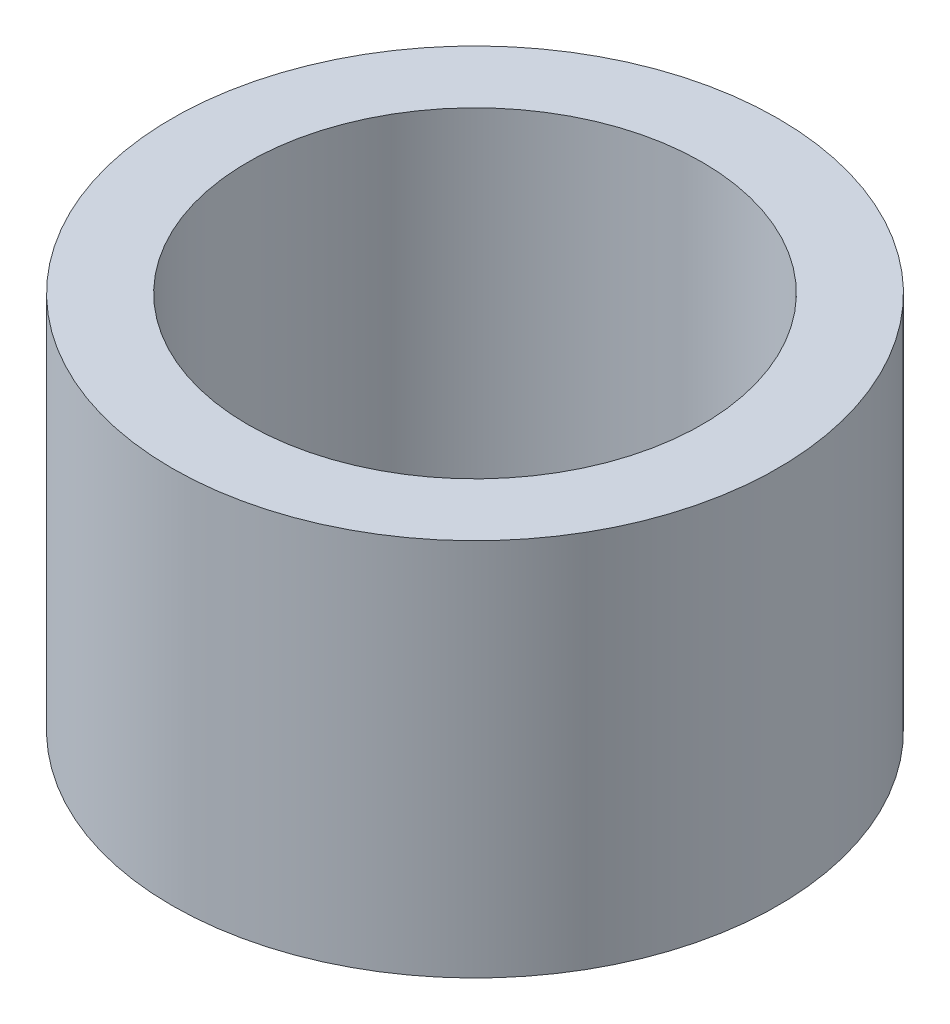
ISO-10303-21;
HEADER;
FILE_DESCRIPTION(('STEP AP214'),'2;1');
FILE_NAME('part.step','',(''),(''),'','','');
FILE_SCHEMA(('AUTOMOTIVE_DESIGN { 1 0 10303 214 1 1 1 1 }'));
ENDSEC;
DATA;
#1=APPLICATION_CONTEXT('core data for automotive mechanical design processes');
#2=APPLICATION_PROTOCOL_DEFINITION('international standard','automotive_design',2000,#1);
#3=PRODUCT_CONTEXT('',#1,'mechanical');
#4=PRODUCT('Part','Part','',(#3));
#5=PRODUCT_RELATED_PRODUCT_CATEGORY('part','',(#4));
#6=PRODUCT_DEFINITION_FORMATION('','',#4);
#7=PRODUCT_DEFINITION_CONTEXT('part definition',#1,'design');
#8=PRODUCT_DEFINITION('design','',#6,#7);
#9=PRODUCT_DEFINITION_SHAPE('','',#8);
#10=(LENGTH_UNIT() NAMED_UNIT(*) SI_UNIT(.MILLI.,.METRE.));
#11=(NAMED_UNIT(*) PLANE_ANGLE_UNIT() SI_UNIT($,.RADIAN.));
#12=(NAMED_UNIT(*) SI_UNIT($,.STERADIAN.) SOLID_ANGLE_UNIT());
#13=UNCERTAINTY_MEASURE_WITH_UNIT(LENGTH_MEASURE(1.E-05),#10,'distance_accuracy_value','');
#14=(GEOMETRIC_REPRESENTATION_CONTEXT(3) GLOBAL_UNCERTAINTY_ASSIGNED_CONTEXT((#13)) GLOBAL_UNIT_ASSIGNED_CONTEXT((#10,
#11,#12)) REPRESENTATION_CONTEXT('',''));
#15=CARTESIAN_POINT('',(0.,0.,0.));
#16=DIRECTION('',(0.,0.,1.));
#17=DIRECTION('',(1.,0.,0.));
#18=AXIS2_PLACEMENT_3D('',#15,#16,#17);
#19=CARTESIAN_POINT('',(0.,2.5,0.));
#20=DIRECTION('',(0.,1.,0.));
#21=DIRECTION('',(0.,0.,1.));
#22=AXIS2_PLACEMENT_3D('',#19,#20,#21);
#23=PLANE('',#22);
#24=CARTESIAN_POINT('',(0.,2.5,0.));
#25=DIRECTION('',(0.,1.,0.));
#26=DIRECTION('',(0.,0.,1.));
#27=AXIS2_PLACEMENT_3D('',#24,#25,#26);
#28=CIRCLE('',#27,2.);
#29=CARTESIAN_POINT('',(0.,2.5,2.));
#30=VERTEX_POINT('',#29);
#31=EDGE_CURVE('E10',#30,#30,#28,.T.);
#32=ORIENTED_EDGE('',*,*,#31,.T.);
#33=EDGE_LOOP('',(#32));
#34=FACE_BOUND('',#33,.T.);
#35=CARTESIAN_POINT('',(0.,2.5,0.));
#36=DIRECTION('',(0.,1.,0.));
#37=DIRECTION('',(0.,0.,1.));
#38=AXIS2_PLACEMENT_3D('',#35,#36,#37);
#39=CIRCLE('',#38,1.5);
#40=CARTESIAN_POINT('',(0.,2.5,1.5));
#41=VERTEX_POINT('',#40);
#42=EDGE_CURVE('E42',#41,#41,#39,.T.);
#43=ORIENTED_EDGE('',*,*,#42,.F.);
#44=EDGE_LOOP('',(#43));
#45=FACE_BOUND('',#44,.T.);
#46=ADVANCED_FACE('F31',(#34,#45),#23,.T.);
#47=CARTESIAN_POINT('',(0.,0.,0.));
#48=DIRECTION('',(0.,1.,0.));
#49=DIRECTION('',(0.,0.,1.));
#50=AXIS2_PLACEMENT_3D('',#47,#48,#49);
#51=PLANE('',#50);
#52=CARTESIAN_POINT('',(0.,0.,0.));
#53=DIRECTION('',(0.,1.,0.));
#54=DIRECTION('',(0.,0.,1.));
#55=AXIS2_PLACEMENT_3D('',#52,#53,#54);
#56=CIRCLE('',#55,2.);
#57=CARTESIAN_POINT('',(0.,0.,2.));
#58=VERTEX_POINT('',#57);
#59=EDGE_CURVE('E35',#58,#58,#56,.T.);
#60=ORIENTED_EDGE('',*,*,#59,.F.);
#61=EDGE_LOOP('',(#60));
#62=FACE_BOUND('',#61,.T.);
#63=CARTESIAN_POINT('',(0.,0.,0.));
#64=DIRECTION('',(0.,1.,0.));
#65=DIRECTION('',(0.,0.,1.));
#66=AXIS2_PLACEMENT_3D('',#63,#64,#65);
#67=CIRCLE('',#66,1.5);
#68=CARTESIAN_POINT('',(0.,0.,1.5));
#69=VERTEX_POINT('',#68);
#70=EDGE_CURVE('E44',#69,#69,#67,.T.);
#71=ORIENTED_EDGE('',*,*,#70,.T.);
#72=EDGE_LOOP('',(#71));
#73=FACE_BOUND('',#72,.T.);
#74=ADVANCED_FACE('F54',(#62,#73),#51,.F.);
#75=CARTESIAN_POINT('',(0.,2.5,0.));
#76=DIRECTION('',(0.,-1.,0.));
#77=DIRECTION('',(0.,0.,-1.));
#78=AXIS2_PLACEMENT_3D('',#75,#76,#77);
#79=CYLINDRICAL_SURFACE('',#78,2.);
#80=ORIENTED_EDGE('',*,*,#31,.F.);
#81=EDGE_LOOP('',(#80));
#82=FACE_BOUND('',#81,.T.);
#83=ORIENTED_EDGE('',*,*,#59,.T.);
#84=EDGE_LOOP('',(#83));
#85=FACE_BOUND('',#84,.T.);
#86=ADVANCED_FACE('F33',(#82,#85),#79,.T.);
#87=CARTESIAN_POINT('',(0.,2.5,0.));
#88=DIRECTION('',(0.,-1.,0.));
#89=DIRECTION('',(0.,0.,-1.));
#90=AXIS2_PLACEMENT_3D('',#87,#88,#89);
#91=CYLINDRICAL_SURFACE('',#90,1.5);
#92=ORIENTED_EDGE('',*,*,#42,.T.);
#93=EDGE_LOOP('',(#92));
#94=FACE_BOUND('',#93,.T.);
#95=ORIENTED_EDGE('',*,*,#70,.F.);
#96=EDGE_LOOP('',(#95));
#97=FACE_BOUND('',#96,.T.);
#98=ADVANCED_FACE('F50',(#94,#97),#91,.F.);
#99=CLOSED_SHELL('',(#46,#74,#86,#98));
#100=MANIFOLD_SOLID_BREP('B2',#99);
#101=ADVANCED_BREP_SHAPE_REPRESENTATION('',(#18,#100),#14);
#102=SHAPE_DEFINITION_REPRESENTATION(#9,#101);
ENDSEC;
END-ISO-10303-21;
